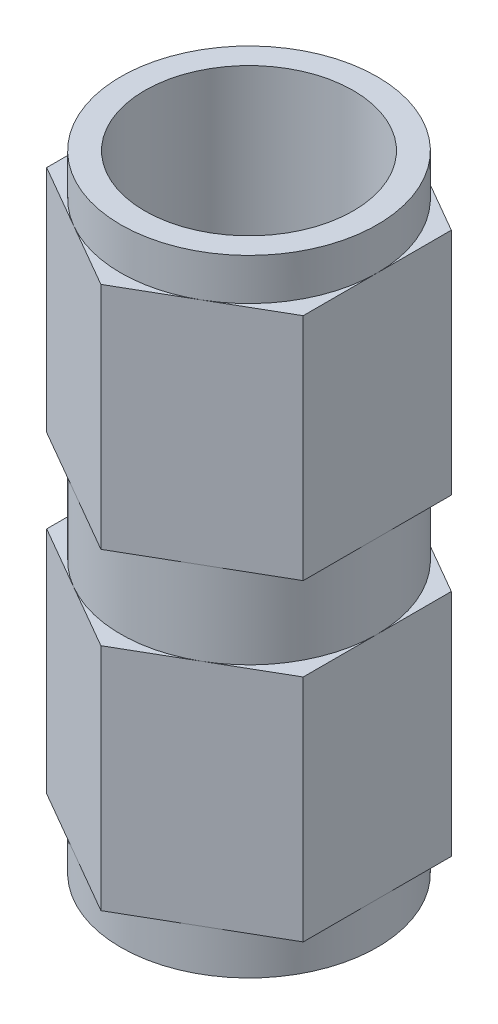
ISO-10303-21;
HEADER;
FILE_DESCRIPTION(('STEP AP214'),'2;1');
FILE_NAME('part.step','',(''),(''),'','','');
FILE_SCHEMA(('AUTOMOTIVE_DESIGN { 1 0 10303 214 1 1 1 1 }'));
ENDSEC;
DATA;
#1=APPLICATION_CONTEXT('core data for automotive mechanical design processes');
#2=APPLICATION_PROTOCOL_DEFINITION('international standard','automotive_design',2000,#1);
#3=PRODUCT_CONTEXT('',#1,'mechanical');
#4=PRODUCT('Part','Part','',(#3));
#5=PRODUCT_RELATED_PRODUCT_CATEGORY('part','',(#4));
#6=PRODUCT_DEFINITION_FORMATION('','',#4);
#7=PRODUCT_DEFINITION_CONTEXT('part definition',#1,'design');
#8=PRODUCT_DEFINITION('design','',#6,#7);
#9=PRODUCT_DEFINITION_SHAPE('','',#8);
#10=(LENGTH_UNIT() NAMED_UNIT(*) SI_UNIT(.MILLI.,.METRE.));
#11=(NAMED_UNIT(*) PLANE_ANGLE_UNIT() SI_UNIT($,.RADIAN.));
#12=(NAMED_UNIT(*) SI_UNIT($,.STERADIAN.) SOLID_ANGLE_UNIT());
#13=UNCERTAINTY_MEASURE_WITH_UNIT(LENGTH_MEASURE(1.E-05),#10,'distance_accuracy_value','');
#14=(GEOMETRIC_REPRESENTATION_CONTEXT(3) GLOBAL_UNCERTAINTY_ASSIGNED_CONTEXT((#13)) GLOBAL_UNIT_ASSIGNED_CONTEXT((#10,
#11,#12)) REPRESENTATION_CONTEXT('',''));
#15=CARTESIAN_POINT('',(0.,0.,0.));
#16=DIRECTION('',(0.,0.,1.));
#17=DIRECTION('',(1.,0.,0.));
#18=AXIS2_PLACEMENT_3D('',#15,#16,#17);
#19=CARTESIAN_POINT('',(7.80895106592428,38.1,4.5085));
#20=DIRECTION('',(-1.,0.,0.));
#21=DIRECTION('',(0.,0.,1.));
#22=AXIS2_PLACEMENT_3D('',#19,#20,#21);
#23=PLANE('',#22);
#24=DIRECTION('',(0.,0.,1.));
#25=VECTOR('',#24,1.);
#26=CARTESIAN_POINT('',(7.80895106592428,21.59,4.5085));
#27=LINE('',#26,#25);
#28=CARTESIAN_POINT('',(7.80895106592428,21.59,-4.5085));
#29=VERTEX_POINT('',#28);
#30=CARTESIAN_POINT('',(7.80895106592428,21.59,0.));
#31=VERTEX_POINT('',#30);
#32=EDGE_CURVE('E290',#29,#31,#27,.T.);
#33=ORIENTED_EDGE('',*,*,#32,.F.);
#34=DIRECTION('',(0.,-1.,0.));
#35=VECTOR('',#34,1.);
#36=CARTESIAN_POINT('',(7.80895106592428,38.1,-4.5085));
#37=LINE('',#36,#35);
#38=CARTESIAN_POINT('',(7.80895106592428,35.56,-4.5085));
#39=VERTEX_POINT('',#38);
#40=EDGE_CURVE('E291',#39,#29,#37,.T.);
#41=ORIENTED_EDGE('',*,*,#40,.F.);
#42=DIRECTION('',(0.,0.,-1.));
#43=VECTOR('',#42,1.);
#44=CARTESIAN_POINT('',(7.80895106592428,35.56,0.));
#45=LINE('',#44,#43);
#46=CARTESIAN_POINT('',(7.80895106592428,35.56,0.));
#47=VERTEX_POINT('',#46);
#48=EDGE_CURVE('E322',#47,#39,#45,.T.);
#49=ORIENTED_EDGE('',*,*,#48,.F.);
#50=DIRECTION('',(0.,0.,-1.));
#51=VECTOR('',#50,1.);
#52=CARTESIAN_POINT('',(7.80895106592428,35.56,0.));
#53=LINE('',#52,#51);
#54=CARTESIAN_POINT('',(7.80895106592428,35.56,4.5085));
#55=VERTEX_POINT('',#54);
#56=EDGE_CURVE('E349',#55,#47,#53,.T.);
#57=ORIENTED_EDGE('',*,*,#56,.F.);
#58=DIRECTION('',(0.,-1.,0.));
#59=VECTOR('',#58,1.);
#60=CARTESIAN_POINT('',(7.80895106592428,38.1,4.5085));
#61=LINE('',#60,#59);
#62=CARTESIAN_POINT('',(7.80895106592428,21.59,4.5085));
#63=VERTEX_POINT('',#62);
#64=EDGE_CURVE('E433',#55,#63,#61,.T.);
#65=ORIENTED_EDGE('',*,*,#64,.T.);
#66=EDGE_CURVE('E298',#31,#63,#27,.T.);
#67=ORIENTED_EDGE('',*,*,#66,.F.);
#68=EDGE_LOOP('',(#33,#41,#49,#57,#65,#67));
#69=FACE_BOUND('',#68,.T.);
#70=ADVANCED_FACE('F98',(#69),#23,.F.);
#71=CARTESIAN_POINT('',(7.80895106592428,38.1,-4.5085));
#72=DIRECTION('',(-0.5,0.,0.866025403784439));
#73=DIRECTION('',(0.866025403784439,0.,0.5));
#74=AXIS2_PLACEMENT_3D('',#71,#72,#73);
#75=PLANE('',#74);
#76=DIRECTION('',(0.866025403784439,0.,0.5));
#77=VECTOR('',#76,1.);
#78=CARTESIAN_POINT('',(7.80895106592428,21.59,-4.5085));
#79=LINE('',#78,#77);
#80=CARTESIAN_POINT('',(0.,21.59,-9.017));
#81=VERTEX_POINT('',#80);
#82=CARTESIAN_POINT('',(3.90447553296214,21.59,-6.76275));
#83=VERTEX_POINT('',#82);
#84=EDGE_CURVE('E265',#81,#83,#79,.T.);
#85=ORIENTED_EDGE('',*,*,#84,.F.);
#86=DIRECTION('',(0.,-1.,0.));
#87=VECTOR('',#86,1.);
#88=CARTESIAN_POINT('',(0.,38.1,-9.017));
#89=LINE('',#88,#87);
#90=CARTESIAN_POINT('',(0.,35.56,-9.017));
#91=VERTEX_POINT('',#90);
#92=EDGE_CURVE('E448',#91,#81,#89,.T.);
#93=ORIENTED_EDGE('',*,*,#92,.F.);
#94=DIRECTION('',(-0.866025403784439,0.,-0.5));
#95=VECTOR('',#94,1.);
#96=CARTESIAN_POINT('',(3.90447553296214,35.56,-6.76275));
#97=LINE('',#96,#95);
#98=CARTESIAN_POINT('',(3.90447553296214,35.56,-6.76275));
#99=VERTEX_POINT('',#98);
#100=EDGE_CURVE('E370',#99,#91,#97,.T.);
#101=ORIENTED_EDGE('',*,*,#100,.F.);
#102=DIRECTION('',(-0.866025403784439,0.,-0.5));
#103=VECTOR('',#102,1.);
#104=CARTESIAN_POINT('',(3.90447553296214,35.56,-6.76275));
#105=LINE('',#104,#103);
#106=EDGE_CURVE('E326',#39,#99,#105,.T.);
#107=ORIENTED_EDGE('',*,*,#106,.F.);
#108=ORIENTED_EDGE('',*,*,#40,.T.);
#109=EDGE_CURVE('E273',#83,#29,#79,.T.);
#110=ORIENTED_EDGE('',*,*,#109,.F.);
#111=EDGE_LOOP('',(#85,#93,#101,#107,#108,#110));
#112=FACE_BOUND('',#111,.T.);
#113=ADVANCED_FACE('F289',(#112),#75,.F.);
#114=CARTESIAN_POINT('',(-7.80895106592428,38.1,4.5085));
#115=DIRECTION('',(0.5,0.,-0.866025403784439));
#116=DIRECTION('',(-0.866025403784439,0.,-0.5));
#117=AXIS2_PLACEMENT_3D('',#114,#115,#116);
#118=PLANE('',#117);
#119=DIRECTION('',(-0.866025403784439,0.,-0.5));
#120=VECTOR('',#119,1.);
#121=CARTESIAN_POINT('',(-7.80895106592428,21.59,4.5085));
#122=LINE('',#121,#120);
#123=CARTESIAN_POINT('',(0.,21.59,9.017));
#124=VERTEX_POINT('',#123);
#125=CARTESIAN_POINT('',(-3.90447553296214,21.59,6.76275));
#126=VERTEX_POINT('',#125);
#127=EDGE_CURVE('E296',#124,#126,#122,.T.);
#128=ORIENTED_EDGE('',*,*,#127,.F.);
#129=DIRECTION('',(0.,-1.,0.));
#130=VECTOR('',#129,1.);
#131=CARTESIAN_POINT('',(0.,38.1,9.017));
#132=LINE('',#131,#130);
#133=CARTESIAN_POINT('',(0.,35.56,9.017));
#134=VERTEX_POINT('',#133);
#135=EDGE_CURVE('E440',#134,#124,#132,.T.);
#136=ORIENTED_EDGE('',*,*,#135,.F.);
#137=DIRECTION('',(0.866025403784439,0.,0.5));
#138=VECTOR('',#137,1.);
#139=CARTESIAN_POINT('',(-3.90447553296214,35.56,6.76275));
#140=LINE('',#139,#138);
#141=CARTESIAN_POINT('',(-3.90447553296214,35.56,6.76275));
#142=VERTEX_POINT('',#141);
#143=EDGE_CURVE('E334',#142,#134,#140,.T.);
#144=ORIENTED_EDGE('',*,*,#143,.F.);
#145=DIRECTION('',(0.866025403784439,0.,0.5));
#146=VECTOR('',#145,1.);
#147=CARTESIAN_POINT('',(-3.90447553296214,35.56,6.76275));
#148=LINE('',#147,#146);
#149=CARTESIAN_POINT('',(-7.80895106592428,35.56,4.5085));
#150=VERTEX_POINT('',#149);
#151=EDGE_CURVE('E363',#150,#142,#148,.T.);
#152=ORIENTED_EDGE('',*,*,#151,.F.);
#153=DIRECTION('',(0.,-1.,0.));
#154=VECTOR('',#153,1.);
#155=CARTESIAN_POINT('',(-7.80895106592428,38.1,4.5085));
#156=LINE('',#155,#154);
#157=CARTESIAN_POINT('',(-7.80895106592428,21.59,4.5085));
#158=VERTEX_POINT('',#157);
#159=EDGE_CURVE('E442',#150,#158,#156,.T.);
#160=ORIENTED_EDGE('',*,*,#159,.T.);
#161=EDGE_CURVE('E294',#126,#158,#122,.T.);
#162=ORIENTED_EDGE('',*,*,#161,.F.);
#163=EDGE_LOOP('',(#128,#136,#144,#152,#160,#162));
#164=FACE_BOUND('',#163,.T.);
#165=ADVANCED_FACE('F529',(#164),#118,.F.);
#166=CARTESIAN_POINT('',(0.,38.1,-9.017));
#167=DIRECTION('',(0.5,0.,0.866025403784439));
#168=DIRECTION('',(0.866025403784439,0.,-0.5));
#169=AXIS2_PLACEMENT_3D('',#166,#167,#168);
#170=PLANE('',#169);
#171=DIRECTION('',(0.866025403784439,0.,-0.5));
#172=VECTOR('',#171,1.);
#173=CARTESIAN_POINT('',(0.,21.59,-9.017));
#174=LINE('',#173,#172);
#175=CARTESIAN_POINT('',(-7.80895106592428,21.59,-4.5085));
#176=VERTEX_POINT('',#175);
#177=CARTESIAN_POINT('',(-3.90447553296214,21.59,-6.76275));
#178=VERTEX_POINT('',#177);
#179=EDGE_CURVE('E301',#176,#178,#174,.T.);
#180=ORIENTED_EDGE('',*,*,#179,.F.);
#181=DIRECTION('',(0.,-1.,0.));
#182=VECTOR('',#181,1.);
#183=CARTESIAN_POINT('',(-7.80895106592428,38.1,-4.5085));
#184=LINE('',#183,#182);
#185=CARTESIAN_POINT('',(-7.80895106592428,35.56,-4.5085));
#186=VERTEX_POINT('',#185);
#187=EDGE_CURVE('E443',#186,#176,#184,.T.);
#188=ORIENTED_EDGE('',*,*,#187,.F.);
#189=DIRECTION('',(-0.866025403784439,0.,0.5));
#190=VECTOR('',#189,1.);
#191=CARTESIAN_POINT('',(-3.90447553296214,35.56,-6.76275));
#192=LINE('',#191,#190);
#193=CARTESIAN_POINT('',(-3.90447553296214,35.56,-6.76275));
#194=VERTEX_POINT('',#193);
#195=EDGE_CURVE('E339',#194,#186,#192,.T.);
#196=ORIENTED_EDGE('',*,*,#195,.F.);
#197=DIRECTION('',(-0.866025403784439,0.,0.5));
#198=VECTOR('',#197,1.);
#199=CARTESIAN_POINT('',(-3.90447553296214,35.56,-6.76275));
#200=LINE('',#199,#198);
#201=EDGE_CURVE('E359',#91,#194,#200,.T.);
#202=ORIENTED_EDGE('',*,*,#201,.F.);
#203=ORIENTED_EDGE('',*,*,#92,.T.);
#204=EDGE_CURVE('E268',#178,#81,#174,.T.);
#205=ORIENTED_EDGE('',*,*,#204,.F.);
#206=EDGE_LOOP('',(#180,#188,#196,#202,#203,#205));
#207=FACE_BOUND('',#206,.T.);
#208=ADVANCED_FACE('F648',(#207),#170,.F.);
#209=CARTESIAN_POINT('',(-7.80895106592428,38.1,-4.5085));
#210=DIRECTION('',(1.,0.,0.));
#211=DIRECTION('',(0.,0.,-1.));
#212=AXIS2_PLACEMENT_3D('',#209,#210,#211);
#213=PLANE('',#212);
#214=DIRECTION('',(0.,0.,-1.));
#215=VECTOR('',#214,1.);
#216=CARTESIAN_POINT('',(-7.80895106592428,21.59,-4.5085));
#217=LINE('',#216,#215);
#218=CARTESIAN_POINT('',(-7.80895106592428,21.59,0.));
#219=VERTEX_POINT('',#218);
#220=EDGE_CURVE('E272',#158,#219,#217,.T.);
#221=ORIENTED_EDGE('',*,*,#220,.F.);
#222=ORIENTED_EDGE('',*,*,#159,.F.);
#223=DIRECTION('',(0.,0.,1.));
#224=VECTOR('',#223,1.);
#225=CARTESIAN_POINT('',(-7.80895106592428,35.56,0.));
#226=LINE('',#225,#224);
#227=CARTESIAN_POINT('',(-7.80895106592428,35.56,0.));
#228=VERTEX_POINT('',#227);
#229=EDGE_CURVE('E356',#228,#150,#226,.T.);
#230=ORIENTED_EDGE('',*,*,#229,.F.);
#231=DIRECTION('',(0.,0.,1.));
#232=VECTOR('',#231,1.);
#233=CARTESIAN_POINT('',(-7.80895106592428,35.56,0.));
#234=LINE('',#233,#232);
#235=EDGE_CURVE('E331',#186,#228,#234,.T.);
#236=ORIENTED_EDGE('',*,*,#235,.F.);
#237=ORIENTED_EDGE('',*,*,#187,.T.);
#238=EDGE_CURVE('E303',#219,#176,#217,.T.);
#239=ORIENTED_EDGE('',*,*,#238,.F.);
#240=EDGE_LOOP('',(#221,#222,#230,#236,#237,#239));
#241=FACE_BOUND('',#240,.T.);
#242=ADVANCED_FACE('F550',(#241),#213,.F.);
#243=CARTESIAN_POINT('',(0.,38.1,9.017));
#244=DIRECTION('',(-0.5,0.,-0.866025403784439));
#245=DIRECTION('',(-0.866025403784439,0.,0.5));
#246=AXIS2_PLACEMENT_3D('',#243,#244,#245);
#247=PLANE('',#246);
#248=DIRECTION('',(-0.866025403784439,0.,0.5));
#249=VECTOR('',#248,1.);
#250=CARTESIAN_POINT('',(0.,21.59,9.017));
#251=LINE('',#250,#249);
#252=CARTESIAN_POINT('',(3.90447553296214,21.59,6.76275));
#253=VERTEX_POINT('',#252);
#254=EDGE_CURVE('E453',#63,#253,#251,.T.);
#255=ORIENTED_EDGE('',*,*,#254,.F.);
#256=ORIENTED_EDGE('',*,*,#64,.F.);
#257=DIRECTION('',(0.866025403784439,0.,-0.5));
#258=VECTOR('',#257,1.);
#259=CARTESIAN_POINT('',(3.90447553296214,35.56,6.76275));
#260=LINE('',#259,#258);
#261=CARTESIAN_POINT('',(3.90447553296214,35.56,6.76275));
#262=VERTEX_POINT('',#261);
#263=EDGE_CURVE('E350',#262,#55,#260,.T.);
#264=ORIENTED_EDGE('',*,*,#263,.F.);
#265=DIRECTION('',(0.866025403784439,0.,-0.5));
#266=VECTOR('',#265,1.);
#267=CARTESIAN_POINT('',(3.90447553296214,35.56,6.76275));
#268=LINE('',#267,#266);
#269=EDGE_CURVE('E336',#134,#262,#268,.T.);
#270=ORIENTED_EDGE('',*,*,#269,.F.);
#271=ORIENTED_EDGE('',*,*,#135,.T.);
#272=EDGE_CURVE('E449',#253,#124,#251,.T.);
#273=ORIENTED_EDGE('',*,*,#272,.F.);
#274=EDGE_LOOP('',(#255,#256,#264,#270,#271,#273));
#275=FACE_BOUND('',#274,.T.);
#276=ADVANCED_FACE('F539',(#275),#247,.F.);
#277=CARTESIAN_POINT('',(0.,38.1,0.));
#278=DIRECTION('',(0.,1.,0.));
#279=DIRECTION('',(0.,0.,1.));
#280=AXIS2_PLACEMENT_3D('',#277,#278,#279);
#281=PLANE('',#280);
#282=CARTESIAN_POINT('',(0.,38.1,0.));
#283=DIRECTION('',(0.,1.,0.));
#284=DIRECTION('',(0.,0.,1.));
#285=AXIS2_PLACEMENT_3D('',#282,#283,#284);
#286=CIRCLE('',#285,6.35);
#287=CARTESIAN_POINT('',(0.,38.1,-6.35));
#288=VERTEX_POINT('',#287);
#289=EDGE_CURVE('E422',#288,#288,#286,.T.);
#290=ORIENTED_EDGE('',*,*,#289,.F.);
#291=EDGE_LOOP('',(#290));
#292=FACE_BOUND('',#291,.T.);
#293=CARTESIAN_POINT('',(0.,38.1,0.));
#294=DIRECTION('',(0.,1.,0.));
#295=DIRECTION('',(0.,0.,1.));
#296=AXIS2_PLACEMENT_3D('',#293,#294,#295);
#297=CIRCLE('',#296,7.80895106592428);
#298=CARTESIAN_POINT('',(0.,38.1,7.80895106592428));
#299=VERTEX_POINT('',#298);
#300=EDGE_CURVE('E337',#299,#299,#297,.T.);
#301=ORIENTED_EDGE('',*,*,#300,.T.);
#302=EDGE_LOOP('',(#301));
#303=FACE_BOUND('',#302,.T.);
#304=ADVANCED_FACE('F534',(#292,#303),#281,.T.);
#305=CARTESIAN_POINT('',(7.80895106592428,16.51,-4.5085));
#306=VERTEX_POINT('',#305);
#307=CARTESIAN_POINT('',(7.80895106592428,2.54000000000001,-4.5085));
#308=VERTEX_POINT('',#307);
#309=EDGE_CURVE('E428',#306,#308,#37,.T.);
#310=ORIENTED_EDGE('',*,*,#309,.F.);
#311=DIRECTION('',(0.,0.,1.));
#312=VECTOR('',#311,1.);
#313=CARTESIAN_POINT('',(7.80895106592428,16.51,4.5085));
#314=LINE('',#313,#312);
#315=CARTESIAN_POINT('',(7.80895106592428,16.51,0.));
#316=VERTEX_POINT('',#315);
#317=EDGE_CURVE('E310',#306,#316,#314,.T.);
#318=ORIENTED_EDGE('',*,*,#317,.T.);
#319=CARTESIAN_POINT('',(7.80895106592428,16.51,4.5085));
#320=VERTEX_POINT('',#319);
#321=EDGE_CURVE('E302',#316,#320,#314,.T.);
#322=ORIENTED_EDGE('',*,*,#321,.T.);
#323=CARTESIAN_POINT('',(7.80895106592428,2.53999999999999,4.5085));
#324=VERTEX_POINT('',#323);
#325=EDGE_CURVE('E435',#320,#324,#61,.T.);
#326=ORIENTED_EDGE('',*,*,#325,.T.);
#327=DIRECTION('',(0.,0.,1.));
#328=VECTOR('',#327,1.);
#329=CARTESIAN_POINT('',(7.80895106592428,2.53999999999999,0.));
#330=LINE('',#329,#328);
#331=CARTESIAN_POINT('',(7.80895106592428,2.53999999999999,0.));
#332=VERTEX_POINT('',#331);
#333=EDGE_CURVE('E379',#332,#324,#330,.T.);
#334=ORIENTED_EDGE('',*,*,#333,.F.);
#335=DIRECTION('',(0.,0.,1.));
#336=VECTOR('',#335,1.);
#337=CARTESIAN_POINT('',(7.80895106592428,2.53999999999999,0.));
#338=LINE('',#337,#336);
#339=EDGE_CURVE('E407',#308,#332,#338,.T.);
#340=ORIENTED_EDGE('',*,*,#339,.F.);
#341=EDGE_LOOP('',(#310,#318,#322,#326,#334,#340));
#342=FACE_BOUND('',#341,.T.);
#343=ADVANCED_FACE('F479',(#342),#23,.F.);
#344=CARTESIAN_POINT('',(0.,16.51,-9.017));
#345=VERTEX_POINT('',#344);
#346=CARTESIAN_POINT('',(0.,2.53999999999999,-9.017));
#347=VERTEX_POINT('',#346);
#348=EDGE_CURVE('E447',#345,#347,#89,.T.);
#349=ORIENTED_EDGE('',*,*,#348,.F.);
#350=DIRECTION('',(0.866025403784439,0.,0.5));
#351=VECTOR('',#350,1.);
#352=CARTESIAN_POINT('',(7.80895106592428,16.51,-4.5085));
#353=LINE('',#352,#351);
#354=CARTESIAN_POINT('',(3.90447553296214,16.51,-6.76275));
#355=VERTEX_POINT('',#354);
#356=EDGE_CURVE('E311',#345,#355,#353,.T.);
#357=ORIENTED_EDGE('',*,*,#356,.T.);
#358=EDGE_CURVE('E309',#355,#306,#353,.T.);
#359=ORIENTED_EDGE('',*,*,#358,.T.);
#360=ORIENTED_EDGE('',*,*,#309,.T.);
#361=DIRECTION('',(0.866025403784439,0.,0.5));
#362=VECTOR('',#361,1.);
#363=CARTESIAN_POINT('',(3.90447553296214,2.53999999999999,-6.76275));
#364=LINE('',#363,#362);
#365=CARTESIAN_POINT('',(3.90447553296214,2.53999999999999,-6.76275));
#366=VERTEX_POINT('',#365);
#367=EDGE_CURVE('E415',#366,#308,#364,.T.);
#368=ORIENTED_EDGE('',*,*,#367,.F.);
#369=DIRECTION('',(0.866025403784439,0.,0.5));
#370=VECTOR('',#369,1.);
#371=CARTESIAN_POINT('',(3.90447553296214,2.53999999999999,-6.76275));
#372=LINE('',#371,#370);
#373=EDGE_CURVE('E391',#347,#366,#372,.T.);
#374=ORIENTED_EDGE('',*,*,#373,.F.);
#375=EDGE_LOOP('',(#349,#357,#359,#360,#368,#374));
#376=FACE_BOUND('',#375,.T.);
#377=ADVANCED_FACE('F99',(#376),#75,.F.);
#378=CARTESIAN_POINT('',(0.,16.51,9.017));
#379=VERTEX_POINT('',#378);
#380=CARTESIAN_POINT('',(0.,2.53999999999999,9.017));
#381=VERTEX_POINT('',#380);
#382=EDGE_CURVE('E436',#379,#381,#132,.T.);
#383=ORIENTED_EDGE('',*,*,#382,.F.);
#384=DIRECTION('',(-0.866025403784439,0.,-0.5));
#385=VECTOR('',#384,1.);
#386=CARTESIAN_POINT('',(-7.80895106592428,16.51,4.5085));
#387=LINE('',#386,#385);
#388=CARTESIAN_POINT('',(-3.90447553296214,16.51,6.76275));
#389=VERTEX_POINT('',#388);
#390=EDGE_CURVE('E123',#379,#389,#387,.T.);
#391=ORIENTED_EDGE('',*,*,#390,.T.);
#392=CARTESIAN_POINT('',(-7.80895106592428,16.51,4.5085));
#393=VERTEX_POINT('',#392);
#394=EDGE_CURVE('E308',#389,#393,#387,.T.);
#395=ORIENTED_EDGE('',*,*,#394,.T.);
#396=CARTESIAN_POINT('',(-7.80895106592428,2.53999999999999,4.5085));
#397=VERTEX_POINT('',#396);
#398=EDGE_CURVE('E439',#393,#397,#156,.T.);
#399=ORIENTED_EDGE('',*,*,#398,.T.);
#400=DIRECTION('',(-0.866025403784439,0.,-0.5));
#401=VECTOR('',#400,1.);
#402=CARTESIAN_POINT('',(-3.90447553296214,2.53999999999999,6.76275));
#403=LINE('',#402,#401);
#404=CARTESIAN_POINT('',(-3.90447553296214,2.53999999999999,6.76275));
#405=VERTEX_POINT('',#404);
#406=EDGE_CURVE('E375',#405,#397,#403,.T.);
#407=ORIENTED_EDGE('',*,*,#406,.F.);
#408=DIRECTION('',(-0.866025403784439,0.,-0.5));
#409=VECTOR('',#408,1.);
#410=CARTESIAN_POINT('',(-3.90447553296214,2.53999999999999,6.76275));
#411=LINE('',#410,#409);
#412=EDGE_CURVE('E411',#381,#405,#411,.T.);
#413=ORIENTED_EDGE('',*,*,#412,.F.);
#414=EDGE_LOOP('',(#383,#391,#395,#399,#407,#413));
#415=FACE_BOUND('',#414,.T.);
#416=ADVANCED_FACE('F468',(#415),#118,.F.);
#417=CARTESIAN_POINT('',(-7.80895106592428,16.51,-4.5085));
#418=VERTEX_POINT('',#417);
#419=CARTESIAN_POINT('',(-7.80895106592428,2.53999999999999,-4.5085));
#420=VERTEX_POINT('',#419);
#421=EDGE_CURVE('E441',#418,#420,#184,.T.);
#422=ORIENTED_EDGE('',*,*,#421,.F.);
#423=DIRECTION('',(0.866025403784439,0.,-0.5));
#424=VECTOR('',#423,1.);
#425=CARTESIAN_POINT('',(0.,16.51,-9.017));
#426=LINE('',#425,#424);
#427=CARTESIAN_POINT('',(-3.90447553296214,16.51,-6.76275));
#428=VERTEX_POINT('',#427);
#429=EDGE_CURVE('E321',#418,#428,#426,.T.);
#430=ORIENTED_EDGE('',*,*,#429,.T.);
#431=EDGE_CURVE('E320',#428,#345,#426,.T.);
#432=ORIENTED_EDGE('',*,*,#431,.T.);
#433=ORIENTED_EDGE('',*,*,#348,.T.);
#434=DIRECTION('',(0.866025403784439,0.,-0.5));
#435=VECTOR('',#434,1.);
#436=CARTESIAN_POINT('',(-3.90447553296214,2.53999999999999,-6.76275));
#437=LINE('',#436,#435);
#438=CARTESIAN_POINT('',(-3.90447553296214,2.53999999999999,-6.76275));
#439=VERTEX_POINT('',#438);
#440=EDGE_CURVE('E389',#439,#347,#437,.T.);
#441=ORIENTED_EDGE('',*,*,#440,.F.);
#442=DIRECTION('',(0.866025403784439,0.,-0.5));
#443=VECTOR('',#442,1.);
#444=CARTESIAN_POINT('',(-3.90447553296214,2.53999999999999,-6.76275));
#445=LINE('',#444,#443);
#446=EDGE_CURVE('E405',#420,#439,#445,.T.);
#447=ORIENTED_EDGE('',*,*,#446,.F.);
#448=EDGE_LOOP('',(#422,#430,#432,#433,#441,#447));
#449=FACE_BOUND('',#448,.T.);
#450=ADVANCED_FACE('F512',(#449),#170,.F.);
#451=ORIENTED_EDGE('',*,*,#398,.F.);
#452=DIRECTION('',(0.,0.,-1.));
#453=VECTOR('',#452,1.);
#454=CARTESIAN_POINT('',(-7.80895106592428,16.51,-4.5085));
#455=LINE('',#454,#453);
#456=CARTESIAN_POINT('',(-7.80895106592428,16.51,0.));
#457=VERTEX_POINT('',#456);
#458=EDGE_CURVE('E314',#393,#457,#455,.T.);
#459=ORIENTED_EDGE('',*,*,#458,.T.);
#460=EDGE_CURVE('E318',#457,#418,#455,.T.);
#461=ORIENTED_EDGE('',*,*,#460,.T.);
#462=ORIENTED_EDGE('',*,*,#421,.T.);
#463=DIRECTION('',(0.,0.,-1.));
#464=VECTOR('',#463,1.);
#465=CARTESIAN_POINT('',(-7.80895106592428,2.53999999999999,0.));
#466=LINE('',#465,#464);
#467=CARTESIAN_POINT('',(-7.80895106592428,2.53999999999999,0.));
#468=VERTEX_POINT('',#467);
#469=EDGE_CURVE('E396',#468,#420,#466,.T.);
#470=ORIENTED_EDGE('',*,*,#469,.F.);
#471=DIRECTION('',(0.,0.,-1.));
#472=VECTOR('',#471,1.);
#473=CARTESIAN_POINT('',(-7.80895106592428,2.53999999999999,0.));
#474=LINE('',#473,#472);
#475=EDGE_CURVE('E374',#397,#468,#474,.T.);
#476=ORIENTED_EDGE('',*,*,#475,.F.);
#477=EDGE_LOOP('',(#451,#459,#461,#462,#470,#476));
#478=FACE_BOUND('',#477,.T.);
#479=ADVANCED_FACE('F496',(#478),#213,.F.);
#480=ORIENTED_EDGE('',*,*,#325,.F.);
#481=DIRECTION('',(-0.866025403784439,0.,0.5));
#482=VECTOR('',#481,1.);
#483=CARTESIAN_POINT('',(0.,16.51,9.017));
#484=LINE('',#483,#482);
#485=CARTESIAN_POINT('',(3.90447553296214,16.51,6.76275));
#486=VERTEX_POINT('',#485);
#487=EDGE_CURVE('E12',#320,#486,#484,.T.);
#488=ORIENTED_EDGE('',*,*,#487,.T.);
#489=EDGE_CURVE('E105',#486,#379,#484,.T.);
#490=ORIENTED_EDGE('',*,*,#489,.T.);
#491=ORIENTED_EDGE('',*,*,#382,.T.);
#492=DIRECTION('',(-0.866025403784439,0.,0.5));
#493=VECTOR('',#492,1.);
#494=CARTESIAN_POINT('',(3.90447553296214,2.53999999999999,6.76275));
#495=LINE('',#494,#493);
#496=CARTESIAN_POINT('',(3.90447553296214,2.53999999999999,6.76275));
#497=VERTEX_POINT('',#496);
#498=EDGE_CURVE('E419',#497,#381,#495,.T.);
#499=ORIENTED_EDGE('',*,*,#498,.F.);
#500=DIRECTION('',(-0.866025403784439,0.,0.5));
#501=VECTOR('',#500,1.);
#502=CARTESIAN_POINT('',(3.90447553296214,2.53999999999999,6.76275));
#503=LINE('',#502,#501);
#504=EDGE_CURVE('E382',#324,#497,#503,.T.);
#505=ORIENTED_EDGE('',*,*,#504,.F.);
#506=EDGE_LOOP('',(#480,#488,#490,#491,#499,#505));
#507=FACE_BOUND('',#506,.T.);
#508=ADVANCED_FACE('F461',(#507),#247,.F.);
#509=CARTESIAN_POINT('',(0.,0.,0.));
#510=DIRECTION('',(0.,1.,0.));
#511=DIRECTION('',(0.,0.,1.));
#512=AXIS2_PLACEMENT_3D('',#509,#510,#511);
#513=PLANE('',#512);
#514=CARTESIAN_POINT('',(0.,0.,0.));
#515=DIRECTION('',(0.,1.,0.));
#516=DIRECTION('',(0.,0.,1.));
#517=AXIS2_PLACEMENT_3D('',#514,#515,#516);
#518=CIRCLE('',#517,6.35);
#519=CARTESIAN_POINT('',(0.,0.,-6.35));
#520=VERTEX_POINT('',#519);
#521=EDGE_CURVE('E403',#520,#520,#518,.T.);
#522=ORIENTED_EDGE('',*,*,#521,.T.);
#523=EDGE_LOOP('',(#522));
#524=FACE_BOUND('',#523,.T.);
#525=CARTESIAN_POINT('',(0.,0.,0.));
#526=DIRECTION('',(0.,-1.,0.));
#527=DIRECTION('',(0.,0.,-1.));
#528=AXIS2_PLACEMENT_3D('',#525,#526,#527);
#529=CIRCLE('',#528,7.80895106592428);
#530=CARTESIAN_POINT('',(0.,0.,-7.80895106592428));
#531=VERTEX_POINT('',#530);
#532=EDGE_CURVE('E397',#531,#531,#529,.T.);
#533=ORIENTED_EDGE('',*,*,#532,.T.);
#534=EDGE_LOOP('',(#533));
#535=FACE_BOUND('',#534,.T.);
#536=ADVANCED_FACE('F551',(#524,#535),#513,.F.);
#537=CARTESIAN_POINT('',(0.,38.1,0.));
#538=DIRECTION('',(0.,-1.,0.));
#539=DIRECTION('',(0.,0.,-1.));
#540=AXIS2_PLACEMENT_3D('',#537,#538,#539);
#541=CYLINDRICAL_SURFACE('',#540,6.35);
#542=CARTESIAN_POINT('',(0.,38.1,-6.35));
#543=CARTESIAN_POINT('',(0.,37.703125,-6.35));
#544=CARTESIAN_POINT('',(0.,37.30625,-6.35));
#545=CARTESIAN_POINT('',(0.,36.5125,-6.35));
#546=CARTESIAN_POINT('',(0.,36.115625,-6.35));
#547=CARTESIAN_POINT('',(0.,35.321875,-6.35));
#548=CARTESIAN_POINT('',(0.,34.925,-6.35));
#549=CARTESIAN_POINT('',(0.,34.13125,-6.35));
#550=CARTESIAN_POINT('',(0.,33.734375,-6.35));
#551=CARTESIAN_POINT('',(0.,32.940625,-6.35));
#552=CARTESIAN_POINT('',(0.,32.54375,-6.35));
#553=CARTESIAN_POINT('',(0.,31.75,-6.35));
#554=CARTESIAN_POINT('',(0.,31.353125,-6.35));
#555=CARTESIAN_POINT('',(0.,30.559375,-6.35));
#556=CARTESIAN_POINT('',(0.,30.1625,-6.35));
#557=CARTESIAN_POINT('',(0.,29.36875,-6.35));
#558=CARTESIAN_POINT('',(0.,28.971875,-6.35));
#559=CARTESIAN_POINT('',(0.,28.178125,-6.35));
#560=CARTESIAN_POINT('',(0.,27.78125,-6.35));
#561=CARTESIAN_POINT('',(0.,26.9875,-6.35));
#562=CARTESIAN_POINT('',(0.,26.590625,-6.35));
#563=CARTESIAN_POINT('',(0.,25.796875,-6.35));
#564=CARTESIAN_POINT('',(0.,25.4,-6.35));
#565=CARTESIAN_POINT('',(0.,24.60625,-6.35));
#566=CARTESIAN_POINT('',(0.,24.209375,-6.35));
#567=CARTESIAN_POINT('',(0.,23.415625,-6.35));
#568=CARTESIAN_POINT('',(0.,23.01875,-6.35));
#569=CARTESIAN_POINT('',(0.,22.225,-6.35));
#570=CARTESIAN_POINT('',(0.,21.828125,-6.35));
#571=CARTESIAN_POINT('',(0.,21.034375,-6.35));
#572=CARTESIAN_POINT('',(0.,20.6375,-6.35));
#573=CARTESIAN_POINT('',(0.,19.84375,-6.35));
#574=CARTESIAN_POINT('',(0.,19.446875,-6.35));
#575=CARTESIAN_POINT('',(0.,18.653125,-6.35));
#576=CARTESIAN_POINT('',(0.,18.25625,-6.35));
#577=CARTESIAN_POINT('',(0.,17.4625,-6.35));
#578=CARTESIAN_POINT('',(0.,17.065625,-6.35));
#579=CARTESIAN_POINT('',(0.,16.271875,-6.35));
#580=CARTESIAN_POINT('',(0.,15.875,-6.35));
#581=CARTESIAN_POINT('',(0.,15.08125,-6.35));
#582=CARTESIAN_POINT('',(0.,14.684375,-6.35));
#583=CARTESIAN_POINT('',(0.,13.890625,-6.35));
#584=CARTESIAN_POINT('',(0.,13.49375,-6.35));
#585=CARTESIAN_POINT('',(0.,12.7,-6.35));
#586=CARTESIAN_POINT('',(0.,12.303125,-6.35));
#587=CARTESIAN_POINT('',(0.,11.509375,-6.35));
#588=CARTESIAN_POINT('',(0.,11.1125,-6.35));
#589=CARTESIAN_POINT('',(0.,10.31875,-6.35));
#590=CARTESIAN_POINT('',(0.,9.921875,-6.35));
#591=CARTESIAN_POINT('',(0.,9.128125,-6.35));
#592=CARTESIAN_POINT('',(0.,8.73125,-6.35));
#593=CARTESIAN_POINT('',(0.,7.9375,-6.35));
#594=CARTESIAN_POINT('',(0.,7.540625,-6.35));
#595=CARTESIAN_POINT('',(0.,6.746875,-6.35));
#596=CARTESIAN_POINT('',(0.,6.35,-6.35));
#597=CARTESIAN_POINT('',(0.,5.55625,-6.35));
#598=CARTESIAN_POINT('',(0.,5.159375,-6.35));
#599=CARTESIAN_POINT('',(0.,4.365625,-6.35));
#600=CARTESIAN_POINT('',(0.,3.96875,-6.35));
#601=CARTESIAN_POINT('',(0.,3.175,-6.35));
#602=CARTESIAN_POINT('',(0.,2.778125,-6.35));
#603=CARTESIAN_POINT('',(0.,1.984375,-6.35));
#604=CARTESIAN_POINT('',(0.,1.5875,-6.35));
#605=CARTESIAN_POINT('',(0.,0.79375,-6.35));
#606=CARTESIAN_POINT('',(0.,0.396875,-6.35));
#607=CARTESIAN_POINT('',(0.,0.,-6.35));
#608=B_SPLINE_CURVE_WITH_KNOTS('',3,(#542,#543,#544,#545,#546,#547,#548,#549,#550,#551,#552,
#553,#554,#555,#556,#557,#558,#559,#560,#561,#562,#563,#564,#565,#566,#567,#568,#569,#570,#571,
#572,#573,#574,#575,#576,#577,#578,#579,#580,#581,#582,#583,#584,#585,#586,#587,#588,#589,#590,
#591,#592,#593,#594,#595,#596,#597,#598,#599,#600,#601,#602,#603,#604,#605,#606,#607),
.UNSPECIFIED.,.F.,.F.,(4,2,2,2,2,2,2,2,2,2,2,2,2,2,2,2,2,2,2,2,2,2,2,2,2,2,2,2,2,2,2,2,4),(0.,
1.19062499999999,2.38124999999999,3.571875,4.7625,5.953125,7.14375,8.33437499999999,9.525,
10.715625,11.90625,13.096875,14.2875,15.478125,16.66875,17.859375,19.05,20.240625,21.43125,
22.621875,23.8125,25.003125,26.19375,27.384375,28.575,29.765625,30.95625,32.146875,33.3375,
34.528125,35.71875,36.909375,38.1),.UNSPECIFIED.);
#609=EDGE_CURVE('BSEAM555',#288,#520,#608,.T.);
#610=ORIENTED_EDGE('',*,*,#289,.T.);
#611=ORIENTED_EDGE('',*,*,#521,.F.);
#612=ORIENTED_EDGE('',*,*,#609,.T.);
#613=ORIENTED_EDGE('',*,*,#609,.F.);
#614=EDGE_LOOP('',(#610,#612,#611,#613));
#615=FACE_BOUND('',#614,.T.);
#616=ADVANCED_FACE('F555',(#615),#541,.F.);
#617=CARTESIAN_POINT('',(0.,2.53999999999999,0.));
#618=DIRECTION('',(0.,-1.,0.));
#619=DIRECTION('',(0.,0.,-1.));
#620=AXIS2_PLACEMENT_3D('',#617,#618,#619);
#621=PLANE('',#620);
#622=CARTESIAN_POINT('',(0.,2.53999999999999,0.));
#623=DIRECTION('',(0.,-1.,0.));
#624=DIRECTION('',(0.,0.,-1.));
#625=AXIS2_PLACEMENT_3D('',#622,#623,#624);
#626=CIRCLE('',#625,7.80895106592428);
#627=EDGE_CURVE('E408',#366,#332,#626,.T.);
#628=ORIENTED_EDGE('',*,*,#627,.F.);
#629=ORIENTED_EDGE('',*,*,#367,.T.);
#630=ORIENTED_EDGE('',*,*,#339,.T.);
#631=EDGE_LOOP('',(#628,#629,#630));
#632=FACE_BOUND('',#631,.T.);
#633=ADVANCED_FACE('F484',(#632),#621,.T.);
#634=CARTESIAN_POINT('',(0.,2.53999999999999,0.));
#635=DIRECTION('',(0.,-1.,0.));
#636=DIRECTION('',(0.,0.,-1.));
#637=AXIS2_PLACEMENT_3D('',#634,#635,#636);
#638=PLANE('',#637);
#639=CARTESIAN_POINT('',(0.,2.53999999999999,0.));
#640=DIRECTION('',(0.,-1.,0.));
#641=DIRECTION('',(0.,0.,-1.));
#642=AXIS2_PLACEMENT_3D('',#639,#640,#641);
#643=CIRCLE('',#642,7.80895106592428);
#644=EDGE_CURVE('E393',#497,#405,#643,.T.);
#645=ORIENTED_EDGE('',*,*,#644,.F.);
#646=ORIENTED_EDGE('',*,*,#498,.T.);
#647=ORIENTED_EDGE('',*,*,#412,.T.);
#648=EDGE_LOOP('',(#645,#646,#647));
#649=FACE_BOUND('',#648,.T.);
#650=ADVANCED_FACE('F473',(#649),#638,.T.);
#651=CARTESIAN_POINT('',(0.,2.53999999999999,0.));
#652=DIRECTION('',(0.,-1.,0.));
#653=DIRECTION('',(0.,0.,-1.));
#654=AXIS2_PLACEMENT_3D('',#651,#652,#653);
#655=CYLINDRICAL_SURFACE('',#654,7.80895106592428);
#656=ORIENTED_EDGE('',*,*,#532,.F.);
#657=EDGE_LOOP('',(#656));
#658=FACE_BOUND('',#657,.T.);
#659=CARTESIAN_POINT('',(0.,2.53999999999999,0.));
#660=DIRECTION('',(0.,-1.,0.));
#661=DIRECTION('',(0.,0.,-1.));
#662=AXIS2_PLACEMENT_3D('',#659,#660,#661);
#663=CIRCLE('',#662,7.80895106592428);
#664=EDGE_CURVE('E365',#405,#468,#663,.T.);
#665=ORIENTED_EDGE('',*,*,#664,.T.);
#666=CARTESIAN_POINT('',(0.,2.53999999999999,0.));
#667=DIRECTION('',(0.,-1.,0.));
#668=DIRECTION('',(0.,0.,-1.));
#669=AXIS2_PLACEMENT_3D('',#666,#667,#668);
#670=CIRCLE('',#669,7.80895106592428);
#671=EDGE_CURVE('E394',#468,#439,#670,.T.);
#672=ORIENTED_EDGE('',*,*,#671,.T.);
#673=CARTESIAN_POINT('',(0.,2.53999999999999,0.));
#674=DIRECTION('',(0.,-1.,0.));
#675=DIRECTION('',(0.,0.,-1.));
#676=AXIS2_PLACEMENT_3D('',#673,#674,#675);
#677=CIRCLE('',#676,7.80895106592428);
#678=EDGE_CURVE('E387',#439,#366,#677,.T.);
#679=ORIENTED_EDGE('',*,*,#678,.T.);
#680=ORIENTED_EDGE('',*,*,#627,.T.);
#681=CARTESIAN_POINT('',(0.,2.53999999999999,0.));
#682=DIRECTION('',(0.,-1.,0.));
#683=DIRECTION('',(0.,0.,-1.));
#684=AXIS2_PLACEMENT_3D('',#681,#682,#683);
#685=CIRCLE('',#684,7.80895106592428);
#686=EDGE_CURVE('E378',#332,#497,#685,.T.);
#687=ORIENTED_EDGE('',*,*,#686,.T.);
#688=ORIENTED_EDGE('',*,*,#644,.T.);
#689=EDGE_LOOP('',(#665,#672,#679,#680,#687,#688));
#690=FACE_BOUND('',#689,.T.);
#691=ADVANCED_FACE('F485',(#658,#690),#655,.T.);
#692=CARTESIAN_POINT('',(0.,2.53999999999999,0.));
#693=DIRECTION('',(0.,-1.,0.));
#694=DIRECTION('',(0.,0.,-1.));
#695=AXIS2_PLACEMENT_3D('',#692,#693,#694);
#696=PLANE('',#695);
#697=ORIENTED_EDGE('',*,*,#671,.F.);
#698=ORIENTED_EDGE('',*,*,#469,.T.);
#699=ORIENTED_EDGE('',*,*,#446,.T.);
#700=EDGE_LOOP('',(#697,#698,#699));
#701=FACE_BOUND('',#700,.T.);
#702=ADVANCED_FACE('F508',(#701),#696,.T.);
#703=CARTESIAN_POINT('',(0.,2.53999999999999,0.));
#704=DIRECTION('',(0.,-1.,0.));
#705=DIRECTION('',(0.,0.,-1.));
#706=AXIS2_PLACEMENT_3D('',#703,#704,#705);
#707=PLANE('',#706);
#708=ORIENTED_EDGE('',*,*,#678,.F.);
#709=ORIENTED_EDGE('',*,*,#440,.T.);
#710=ORIENTED_EDGE('',*,*,#373,.T.);
#711=EDGE_LOOP('',(#708,#709,#710));
#712=FACE_BOUND('',#711,.T.);
#713=ADVANCED_FACE('F514',(#712),#707,.T.);
#714=CARTESIAN_POINT('',(0.,2.53999999999999,0.));
#715=DIRECTION('',(0.,-1.,0.));
#716=DIRECTION('',(0.,0.,-1.));
#717=AXIS2_PLACEMENT_3D('',#714,#715,#716);
#718=PLANE('',#717);
#719=ORIENTED_EDGE('',*,*,#686,.F.);
#720=ORIENTED_EDGE('',*,*,#333,.T.);
#721=ORIENTED_EDGE('',*,*,#504,.T.);
#722=EDGE_LOOP('',(#719,#720,#721));
#723=FACE_BOUND('',#722,.T.);
#724=ADVANCED_FACE('F475',(#723),#718,.T.);
#725=CARTESIAN_POINT('',(0.,2.53999999999999,0.));
#726=DIRECTION('',(0.,-1.,0.));
#727=DIRECTION('',(0.,0.,-1.));
#728=AXIS2_PLACEMENT_3D('',#725,#726,#727);
#729=PLANE('',#728);
#730=ORIENTED_EDGE('',*,*,#664,.F.);
#731=ORIENTED_EDGE('',*,*,#406,.T.);
#732=ORIENTED_EDGE('',*,*,#475,.T.);
#733=EDGE_LOOP('',(#730,#731,#732));
#734=FACE_BOUND('',#733,.T.);
#735=ADVANCED_FACE('F503',(#734),#729,.T.);
#736=CARTESIAN_POINT('',(0.,35.56,0.));
#737=DIRECTION('',(0.,1.,0.));
#738=DIRECTION('',(0.,0.,1.));
#739=AXIS2_PLACEMENT_3D('',#736,#737,#738);
#740=PLANE('',#739);
#741=CARTESIAN_POINT('',(0.,35.56,0.));
#742=DIRECTION('',(0.,1.,0.));
#743=DIRECTION('',(0.,0.,1.));
#744=AXIS2_PLACEMENT_3D('',#741,#742,#743);
#745=CIRCLE('',#744,7.80895106592428);
#746=EDGE_CURVE('E354',#228,#142,#745,.T.);
#747=ORIENTED_EDGE('',*,*,#746,.F.);
#748=ORIENTED_EDGE('',*,*,#229,.T.);
#749=ORIENTED_EDGE('',*,*,#151,.T.);
#750=EDGE_LOOP('',(#747,#748,#749));
#751=FACE_BOUND('',#750,.T.);
#752=ADVANCED_FACE('F624',(#751),#740,.T.);
#753=CARTESIAN_POINT('',(0.,35.56,0.));
#754=DIRECTION('',(0.,1.,0.));
#755=DIRECTION('',(0.,0.,1.));
#756=AXIS2_PLACEMENT_3D('',#753,#754,#755);
#757=PLANE('',#756);
#758=CARTESIAN_POINT('',(0.,35.56,0.));
#759=DIRECTION('',(0.,1.,0.));
#760=DIRECTION('',(0.,0.,1.));
#761=AXIS2_PLACEMENT_3D('',#758,#759,#760);
#762=CIRCLE('',#761,7.80895106592428);
#763=EDGE_CURVE('E355',#99,#194,#762,.T.);
#764=ORIENTED_EDGE('',*,*,#763,.F.);
#765=ORIENTED_EDGE('',*,*,#100,.T.);
#766=ORIENTED_EDGE('',*,*,#201,.T.);
#767=EDGE_LOOP('',(#764,#765,#766));
#768=FACE_BOUND('',#767,.T.);
#769=ADVANCED_FACE('F680',(#768),#757,.T.);
#770=CARTESIAN_POINT('',(0.,35.56,0.));
#771=DIRECTION('',(0.,1.,0.));
#772=DIRECTION('',(0.,0.,1.));
#773=AXIS2_PLACEMENT_3D('',#770,#771,#772);
#774=CYLINDRICAL_SURFACE('',#773,7.80895106592428);
#775=ORIENTED_EDGE('',*,*,#300,.F.);
#776=EDGE_LOOP('',(#775));
#777=FACE_BOUND('',#776,.T.);
#778=CARTESIAN_POINT('',(0.,35.56,0.));
#779=DIRECTION('',(0.,1.,0.));
#780=DIRECTION('',(0.,0.,1.));
#781=AXIS2_PLACEMENT_3D('',#778,#779,#780);
#782=CIRCLE('',#781,7.80895106592428);
#783=EDGE_CURVE('E325',#47,#99,#782,.T.);
#784=ORIENTED_EDGE('',*,*,#783,.T.);
#785=ORIENTED_EDGE('',*,*,#763,.T.);
#786=CARTESIAN_POINT('',(0.,35.56,0.));
#787=DIRECTION('',(0.,1.,0.));
#788=DIRECTION('',(0.,0.,1.));
#789=AXIS2_PLACEMENT_3D('',#786,#787,#788);
#790=CIRCLE('',#789,7.80895106592428);
#791=EDGE_CURVE('E328',#194,#228,#790,.T.);
#792=ORIENTED_EDGE('',*,*,#791,.T.);
#793=ORIENTED_EDGE('',*,*,#746,.T.);
#794=CARTESIAN_POINT('',(0.,35.56,0.));
#795=DIRECTION('',(0.,1.,0.));
#796=DIRECTION('',(0.,0.,1.));
#797=AXIS2_PLACEMENT_3D('',#794,#795,#796);
#798=CIRCLE('',#797,7.80895106592428);
#799=EDGE_CURVE('E329',#142,#262,#798,.T.);
#800=ORIENTED_EDGE('',*,*,#799,.T.);
#801=CARTESIAN_POINT('',(0.,35.56,0.));
#802=DIRECTION('',(0.,1.,0.));
#803=DIRECTION('',(0.,0.,1.));
#804=AXIS2_PLACEMENT_3D('',#801,#802,#803);
#805=CIRCLE('',#804,7.80895106592428);
#806=EDGE_CURVE('E342',#262,#47,#805,.T.);
#807=ORIENTED_EDGE('',*,*,#806,.T.);
#808=EDGE_LOOP('',(#784,#785,#792,#793,#800,#807));
#809=FACE_BOUND('',#808,.T.);
#810=ADVANCED_FACE('F690',(#777,#809),#774,.T.);
#811=CARTESIAN_POINT('',(0.,35.56,0.));
#812=DIRECTION('',(0.,1.,0.));
#813=DIRECTION('',(0.,0.,1.));
#814=AXIS2_PLACEMENT_3D('',#811,#812,#813);
#815=PLANE('',#814);
#816=ORIENTED_EDGE('',*,*,#806,.F.);
#817=ORIENTED_EDGE('',*,*,#263,.T.);
#818=ORIENTED_EDGE('',*,*,#56,.T.);
#819=EDGE_LOOP('',(#816,#817,#818));
#820=FACE_BOUND('',#819,.T.);
#821=ADVANCED_FACE('F700',(#820),#815,.T.);
#822=CARTESIAN_POINT('',(0.,35.56,0.));
#823=DIRECTION('',(0.,1.,0.));
#824=DIRECTION('',(0.,0.,1.));
#825=AXIS2_PLACEMENT_3D('',#822,#823,#824);
#826=PLANE('',#825);
#827=ORIENTED_EDGE('',*,*,#799,.F.);
#828=ORIENTED_EDGE('',*,*,#143,.T.);
#829=ORIENTED_EDGE('',*,*,#269,.T.);
#830=EDGE_LOOP('',(#827,#828,#829));
#831=FACE_BOUND('',#830,.T.);
#832=ADVANCED_FACE('F725',(#831),#826,.T.);
#833=CARTESIAN_POINT('',(0.,35.56,0.));
#834=DIRECTION('',(0.,1.,0.));
#835=DIRECTION('',(0.,0.,1.));
#836=AXIS2_PLACEMENT_3D('',#833,#834,#835);
#837=PLANE('',#836);
#838=ORIENTED_EDGE('',*,*,#791,.F.);
#839=ORIENTED_EDGE('',*,*,#195,.T.);
#840=ORIENTED_EDGE('',*,*,#235,.T.);
#841=EDGE_LOOP('',(#838,#839,#840));
#842=FACE_BOUND('',#841,.T.);
#843=ADVANCED_FACE('F735',(#842),#837,.T.);
#844=CARTESIAN_POINT('',(0.,35.56,0.));
#845=DIRECTION('',(0.,1.,0.));
#846=DIRECTION('',(0.,0.,1.));
#847=AXIS2_PLACEMENT_3D('',#844,#845,#846);
#848=PLANE('',#847);
#849=ORIENTED_EDGE('',*,*,#783,.F.);
#850=ORIENTED_EDGE('',*,*,#48,.T.);
#851=ORIENTED_EDGE('',*,*,#106,.T.);
#852=EDGE_LOOP('',(#849,#850,#851));
#853=FACE_BOUND('',#852,.T.);
#854=ADVANCED_FACE('F745',(#853),#848,.T.);
#855=CARTESIAN_POINT('',(0.,16.51,0.));
#856=DIRECTION('',(0.,1.,0.));
#857=DIRECTION('',(0.,0.,1.));
#858=AXIS2_PLACEMENT_3D('',#855,#856,#857);
#859=CYLINDRICAL_SURFACE('',#858,7.80895106592428);
#860=CARTESIAN_POINT('',(0.,16.51,0.));
#861=DIRECTION('',(0.,-1.,0.));
#862=DIRECTION('',(0.,0.,-1.));
#863=AXIS2_PLACEMENT_3D('',#860,#861,#862);
#864=CIRCLE('',#863,7.80895106592428);
#865=EDGE_CURVE('E926',#316,#486,#864,.T.);
#866=ORIENTED_EDGE('',*,*,#865,.F.);
#867=EDGE_CURVE('E905',#355,#316,#864,.T.);
#868=ORIENTED_EDGE('',*,*,#867,.F.);
#869=EDGE_CURVE('E286',#428,#355,#864,.T.);
#870=ORIENTED_EDGE('',*,*,#869,.F.);
#871=EDGE_CURVE('E931',#457,#428,#864,.T.);
#872=ORIENTED_EDGE('',*,*,#871,.F.);
#873=EDGE_CURVE('E933',#389,#457,#864,.T.);
#874=ORIENTED_EDGE('',*,*,#873,.F.);
#875=EDGE_CURVE('E927',#486,#389,#864,.T.);
#876=ORIENTED_EDGE('',*,*,#875,.F.);
#877=EDGE_LOOP('',(#866,#868,#870,#872,#874,#876));
#878=FACE_BOUND('',#877,.T.);
#879=CARTESIAN_POINT('',(0.,21.59,0.));
#880=DIRECTION('',(0.,-1.,0.));
#881=DIRECTION('',(0.,0.,-1.));
#882=AXIS2_PLACEMENT_3D('',#879,#880,#881);
#883=CIRCLE('',#882,7.80895106592428);
#884=EDGE_CURVE('E114',#31,#253,#883,.T.);
#885=ORIENTED_EDGE('',*,*,#884,.T.);
#886=EDGE_CURVE('E899',#253,#126,#883,.T.);
#887=ORIENTED_EDGE('',*,*,#886,.T.);
#888=EDGE_CURVE('E902',#126,#219,#883,.T.);
#889=ORIENTED_EDGE('',*,*,#888,.T.);
#890=EDGE_CURVE('E285',#219,#178,#883,.T.);
#891=ORIENTED_EDGE('',*,*,#890,.T.);
#892=EDGE_CURVE('E264',#178,#83,#883,.T.);
#893=ORIENTED_EDGE('',*,*,#892,.T.);
#894=EDGE_CURVE('E279',#83,#31,#883,.T.);
#895=ORIENTED_EDGE('',*,*,#894,.T.);
#896=EDGE_LOOP('',(#885,#887,#889,#891,#893,#895));
#897=FACE_BOUND('',#896,.T.);
#898=ADVANCED_FACE('F280',(#878,#897),#859,.T.);
#899=CARTESIAN_POINT('',(0.,16.51,0.));
#900=DIRECTION('',(0.,-1.,0.));
#901=DIRECTION('',(0.,0.,-1.));
#902=AXIS2_PLACEMENT_3D('',#899,#900,#901);
#903=PLANE('',#902);
#904=ORIENTED_EDGE('',*,*,#871,.T.);
#905=ORIENTED_EDGE('',*,*,#429,.F.);
#906=ORIENTED_EDGE('',*,*,#460,.F.);
#907=EDGE_LOOP('',(#904,#905,#906));
#908=FACE_BOUND('',#907,.T.);
#909=ADVANCED_FACE('F793',(#908),#903,.F.);
#910=ORIENTED_EDGE('',*,*,#869,.T.);
#911=ORIENTED_EDGE('',*,*,#356,.F.);
#912=ORIENTED_EDGE('',*,*,#431,.F.);
#913=EDGE_LOOP('',(#910,#911,#912));
#914=FACE_BOUND('',#913,.T.);
#915=ADVANCED_FACE('F805',(#914),#903,.F.);
#916=ORIENTED_EDGE('',*,*,#394,.F.);
#917=ORIENTED_EDGE('',*,*,#873,.T.);
#918=ORIENTED_EDGE('',*,*,#458,.F.);
#919=EDGE_LOOP('',(#916,#917,#918));
#920=FACE_BOUND('',#919,.T.);
#921=ADVANCED_FACE('F814',(#920),#903,.F.);
#922=ORIENTED_EDGE('',*,*,#867,.T.);
#923=ORIENTED_EDGE('',*,*,#317,.F.);
#924=ORIENTED_EDGE('',*,*,#358,.F.);
#925=EDGE_LOOP('',(#922,#923,#924));
#926=FACE_BOUND('',#925,.T.);
#927=ADVANCED_FACE('F823',(#926),#903,.F.);
#928=ORIENTED_EDGE('',*,*,#865,.T.);
#929=ORIENTED_EDGE('',*,*,#487,.F.);
#930=ORIENTED_EDGE('',*,*,#321,.F.);
#931=EDGE_LOOP('',(#928,#929,#930));
#932=FACE_BOUND('',#931,.T.);
#933=ADVANCED_FACE('F835',(#932),#903,.F.);
#934=ORIENTED_EDGE('',*,*,#489,.F.);
#935=ORIENTED_EDGE('',*,*,#875,.T.);
#936=ORIENTED_EDGE('',*,*,#390,.F.);
#937=EDGE_LOOP('',(#934,#935,#936));
#938=FACE_BOUND('',#937,.T.);
#939=ADVANCED_FACE('F810',(#938),#903,.F.);
#940=CARTESIAN_POINT('',(0.,21.59,0.));
#941=DIRECTION('',(0.,-1.,0.));
#942=DIRECTION('',(0.,0.,-1.));
#943=AXIS2_PLACEMENT_3D('',#940,#941,#942);
#944=PLANE('',#943);
#945=ORIENTED_EDGE('',*,*,#238,.T.);
#946=ORIENTED_EDGE('',*,*,#179,.T.);
#947=ORIENTED_EDGE('',*,*,#890,.F.);
#948=EDGE_LOOP('',(#945,#946,#947));
#949=FACE_BOUND('',#948,.T.);
#950=ADVANCED_FACE('F847',(#949),#944,.T.);
#951=ORIENTED_EDGE('',*,*,#204,.T.);
#952=ORIENTED_EDGE('',*,*,#84,.T.);
#953=ORIENTED_EDGE('',*,*,#892,.F.);
#954=EDGE_LOOP('',(#951,#952,#953));
#955=FACE_BOUND('',#954,.T.);
#956=ADVANCED_FACE('F262',(#955),#944,.T.);
#957=ORIENTED_EDGE('',*,*,#220,.T.);
#958=ORIENTED_EDGE('',*,*,#888,.F.);
#959=ORIENTED_EDGE('',*,*,#161,.T.);
#960=EDGE_LOOP('',(#957,#958,#959));
#961=FACE_BOUND('',#960,.T.);
#962=ADVANCED_FACE('F866',(#961),#944,.T.);
#963=ORIENTED_EDGE('',*,*,#109,.T.);
#964=ORIENTED_EDGE('',*,*,#32,.T.);
#965=ORIENTED_EDGE('',*,*,#894,.F.);
#966=EDGE_LOOP('',(#963,#964,#965));
#967=FACE_BOUND('',#966,.T.);
#968=ADVANCED_FACE('F284',(#967),#944,.T.);
#969=ORIENTED_EDGE('',*,*,#66,.T.);
#970=ORIENTED_EDGE('',*,*,#254,.T.);
#971=ORIENTED_EDGE('',*,*,#884,.F.);
#972=EDGE_LOOP('',(#969,#970,#971));
#973=FACE_BOUND('',#972,.T.);
#974=ADVANCED_FACE('F885',(#973),#944,.T.);
#975=ORIENTED_EDGE('',*,*,#127,.T.);
#976=ORIENTED_EDGE('',*,*,#886,.F.);
#977=ORIENTED_EDGE('',*,*,#272,.T.);
#978=EDGE_LOOP('',(#975,#976,#977));
#979=FACE_BOUND('',#978,.T.);
#980=ADVANCED_FACE('F856',(#979),#944,.T.);
#981=CLOSED_SHELL('',(#70,#113,#165,#208,#242,#276,#304,#343,#377,#416,#450,#479,#508,#536,#616,
#633,#650,#691,#702,#713,#724,#735,#752,#769,#810,#821,#832,#843,#854,#898,#909,#915,#921,#927,
#933,#939,#950,#956,#962,#968,#974,#980));
#982=MANIFOLD_SOLID_BREP('B2',#981);
#983=ADVANCED_BREP_SHAPE_REPRESENTATION('',(#18,#982),#14);
#984=SHAPE_DEFINITION_REPRESENTATION(#9,#983);
ENDSEC;
END-ISO-10303-21;
